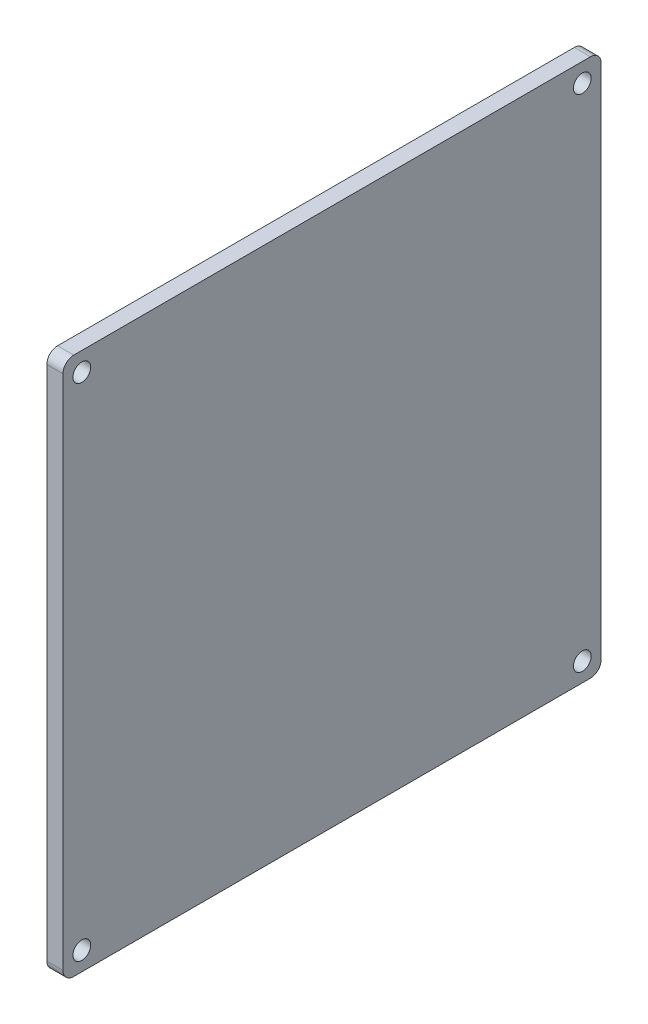
ISO-10303-21;
HEADER;
FILE_DESCRIPTION(('STEP AP214'),'2;1');
FILE_NAME('part.step','',(''),(''),'','','');
FILE_SCHEMA(('AUTOMOTIVE_DESIGN { 1 0 10303 214 1 1 1 1 }'));
ENDSEC;
DATA;
#1=APPLICATION_CONTEXT('core data for automotive mechanical design processes');
#2=APPLICATION_PROTOCOL_DEFINITION('international standard','automotive_design',2000,#1);
#3=PRODUCT_CONTEXT('',#1,'mechanical');
#4=PRODUCT('Part','Part','',(#3));
#5=PRODUCT_RELATED_PRODUCT_CATEGORY('part','',(#4));
#6=PRODUCT_DEFINITION_FORMATION('','',#4);
#7=PRODUCT_DEFINITION_CONTEXT('part definition',#1,'design');
#8=PRODUCT_DEFINITION('design','',#6,#7);
#9=PRODUCT_DEFINITION_SHAPE('','',#8);
#10=(LENGTH_UNIT() NAMED_UNIT(*) SI_UNIT(.MILLI.,.METRE.));
#11=(NAMED_UNIT(*) PLANE_ANGLE_UNIT() SI_UNIT($,.RADIAN.));
#12=(NAMED_UNIT(*) SI_UNIT($,.STERADIAN.) SOLID_ANGLE_UNIT());
#13=UNCERTAINTY_MEASURE_WITH_UNIT(LENGTH_MEASURE(1.E-05),#10,'distance_accuracy_value','');
#14=(GEOMETRIC_REPRESENTATION_CONTEXT(3) GLOBAL_UNCERTAINTY_ASSIGNED_CONTEXT((#13)) GLOBAL_UNIT_ASSIGNED_CONTEXT((#10,
#11,#12)) REPRESENTATION_CONTEXT('',''));
#15=CARTESIAN_POINT('',(0.,0.,0.));
#16=DIRECTION('',(0.,0.,1.));
#17=DIRECTION('',(1.,0.,0.));
#18=AXIS2_PLACEMENT_3D('',#15,#16,#17);
#19=CARTESIAN_POINT('',(3.,0.,0.));
#20=DIRECTION('',(0.,0.,-1.));
#21=DIRECTION('',(0.,1.,0.));
#22=AXIS2_PLACEMENT_3D('',#19,#20,#21);
#23=PLANE('',#22);
#24=DIRECTION('',(0.,-1.,0.));
#25=VECTOR('',#24,1.);
#26=CARTESIAN_POINT('',(3.,0.,0.));
#27=LINE('',#26,#25);
#28=CARTESIAN_POINT('',(3.,-2.,0.));
#29=VERTEX_POINT('',#28);
#30=CARTESIAN_POINT('',(3.,-98.,0.));
#31=VERTEX_POINT('',#30);
#32=EDGE_CURVE('E127',#29,#31,#27,.T.);
#33=ORIENTED_EDGE('',*,*,#32,.F.);
#34=DIRECTION('',(-1.,0.,0.));
#35=VECTOR('',#34,1.);
#36=CARTESIAN_POINT('',(3.,-2.,0.));
#37=LINE('',#36,#35);
#38=CARTESIAN_POINT('',(0.,-2.,0.));
#39=VERTEX_POINT('',#38);
#40=EDGE_CURVE('E141',#29,#39,#37,.T.);
#41=ORIENTED_EDGE('',*,*,#40,.T.);
#42=DIRECTION('',(0.,-1.,0.));
#43=VECTOR('',#42,1.);
#44=CARTESIAN_POINT('',(0.,0.,0.));
#45=LINE('',#44,#43);
#46=CARTESIAN_POINT('',(0.,-98.,0.));
#47=VERTEX_POINT('',#46);
#48=EDGE_CURVE('E162',#39,#47,#45,.T.);
#49=ORIENTED_EDGE('',*,*,#48,.T.);
#50=DIRECTION('',(-1.,0.,0.));
#51=VECTOR('',#50,1.);
#52=CARTESIAN_POINT('',(3.,-98.,0.));
#53=LINE('',#52,#51);
#54=EDGE_CURVE('E139',#47,#31,#53,.F.);
#55=ORIENTED_EDGE('',*,*,#54,.T.);
#56=EDGE_LOOP('',(#33,#41,#49,#55));
#57=FACE_BOUND('',#56,.T.);
#58=ADVANCED_FACE('F36',(#57),#23,.F.);
#59=CARTESIAN_POINT('',(3.,-100.,0.));
#60=DIRECTION('',(0.,1.,0.));
#61=DIRECTION('',(0.,0.,1.));
#62=AXIS2_PLACEMENT_3D('',#59,#60,#61);
#63=PLANE('',#62);
#64=DIRECTION('',(0.,0.,-1.));
#65=VECTOR('',#64,1.);
#66=CARTESIAN_POINT('',(3.,-100.,0.));
#67=LINE('',#66,#65);
#68=CARTESIAN_POINT('',(3.,-100.,-2.00000000000001));
#69=VERTEX_POINT('',#68);
#70=CARTESIAN_POINT('',(3.,-100.,-98.));
#71=VERTEX_POINT('',#70);
#72=EDGE_CURVE('E130',#69,#71,#67,.T.);
#73=ORIENTED_EDGE('',*,*,#72,.F.);
#74=DIRECTION('',(-1.,0.,0.));
#75=VECTOR('',#74,1.);
#76=CARTESIAN_POINT('',(3.,-100.,-2.00000000000001));
#77=LINE('',#76,#75);
#78=CARTESIAN_POINT('',(0.,-100.,-2.00000000000001));
#79=VERTEX_POINT('',#78);
#80=EDGE_CURVE('E44',#69,#79,#77,.T.);
#81=ORIENTED_EDGE('',*,*,#80,.T.);
#82=DIRECTION('',(0.,0.,-1.));
#83=VECTOR('',#82,1.);
#84=CARTESIAN_POINT('',(0.,-100.,0.));
#85=LINE('',#84,#83);
#86=CARTESIAN_POINT('',(0.,-100.,-98.));
#87=VERTEX_POINT('',#86);
#88=EDGE_CURVE('E132',#79,#87,#85,.T.);
#89=ORIENTED_EDGE('',*,*,#88,.T.);
#90=DIRECTION('',(-1.,0.,0.));
#91=VECTOR('',#90,1.);
#92=CARTESIAN_POINT('',(3.,-100.,-98.));
#93=LINE('',#92,#91);
#94=EDGE_CURVE('E51',#87,#71,#93,.F.);
#95=ORIENTED_EDGE('',*,*,#94,.T.);
#96=EDGE_LOOP('',(#73,#81,#89,#95));
#97=FACE_BOUND('',#96,.T.);
#98=ADVANCED_FACE('F159',(#97),#63,.F.);
#99=CARTESIAN_POINT('',(3.,0.,-100.));
#100=DIRECTION('',(0.,0.,1.));
#101=DIRECTION('',(0.,-1.,0.));
#102=AXIS2_PLACEMENT_3D('',#99,#100,#101);
#103=PLANE('',#102);
#104=DIRECTION('',(0.,1.,0.));
#105=VECTOR('',#104,1.);
#106=CARTESIAN_POINT('',(3.,0.,-100.));
#107=LINE('',#106,#105);
#108=CARTESIAN_POINT('',(3.,-98.,-100.));
#109=VERTEX_POINT('',#108);
#110=CARTESIAN_POINT('',(3.,-2.,-100.));
#111=VERTEX_POINT('',#110);
#112=EDGE_CURVE('E167',#109,#111,#107,.T.);
#113=ORIENTED_EDGE('',*,*,#112,.F.);
#114=DIRECTION('',(-1.,0.,0.));
#115=VECTOR('',#114,1.);
#116=CARTESIAN_POINT('',(3.,-98.,-100.));
#117=LINE('',#116,#115);
#118=CARTESIAN_POINT('',(0.,-98.,-100.));
#119=VERTEX_POINT('',#118);
#120=EDGE_CURVE('E11',#109,#119,#117,.T.);
#121=ORIENTED_EDGE('',*,*,#120,.T.);
#122=DIRECTION('',(0.,1.,0.));
#123=VECTOR('',#122,1.);
#124=CARTESIAN_POINT('',(0.,0.,-100.));
#125=LINE('',#124,#123);
#126=CARTESIAN_POINT('',(0.,-2.,-100.));
#127=VERTEX_POINT('',#126);
#128=EDGE_CURVE('E128',#119,#127,#125,.T.);
#129=ORIENTED_EDGE('',*,*,#128,.T.);
#130=DIRECTION('',(-1.,0.,0.));
#131=VECTOR('',#130,1.);
#132=CARTESIAN_POINT('',(3.,-2.,-100.));
#133=LINE('',#132,#131);
#134=EDGE_CURVE('E110',#127,#111,#133,.F.);
#135=ORIENTED_EDGE('',*,*,#134,.T.);
#136=EDGE_LOOP('',(#113,#121,#129,#135));
#137=FACE_BOUND('',#136,.T.);
#138=ADVANCED_FACE('F232',(#137),#103,.F.);
#139=CARTESIAN_POINT('',(3.,0.,0.));
#140=DIRECTION('',(0.,-1.,0.));
#141=DIRECTION('',(0.,0.,-1.));
#142=AXIS2_PLACEMENT_3D('',#139,#140,#141);
#143=PLANE('',#142);
#144=DIRECTION('',(0.,0.,1.));
#145=VECTOR('',#144,1.);
#146=CARTESIAN_POINT('',(0.,0.,0.));
#147=LINE('',#146,#145);
#148=CARTESIAN_POINT('',(0.,0.,-98.));
#149=VERTEX_POINT('',#148);
#150=CARTESIAN_POINT('',(0.,0.,-2.));
#151=VERTEX_POINT('',#150);
#152=EDGE_CURVE('E119',#149,#151,#147,.T.);
#153=ORIENTED_EDGE('',*,*,#152,.T.);
#154=DIRECTION('',(-1.,0.,0.));
#155=VECTOR('',#154,1.);
#156=CARTESIAN_POINT('',(3.,0.,-2.));
#157=LINE('',#156,#155);
#158=CARTESIAN_POINT('',(3.,0.,-2.));
#159=VERTEX_POINT('',#158);
#160=EDGE_CURVE('E149',#151,#159,#157,.F.);
#161=ORIENTED_EDGE('',*,*,#160,.T.);
#162=DIRECTION('',(0.,0.,1.));
#163=VECTOR('',#162,1.);
#164=CARTESIAN_POINT('',(3.,0.,0.));
#165=LINE('',#164,#163);
#166=CARTESIAN_POINT('',(3.,0.,-98.));
#167=VERTEX_POINT('',#166);
#168=EDGE_CURVE('E122',#167,#159,#165,.T.);
#169=ORIENTED_EDGE('',*,*,#168,.F.);
#170=DIRECTION('',(-1.,0.,0.));
#171=VECTOR('',#170,1.);
#172=CARTESIAN_POINT('',(3.,0.,-98.));
#173=LINE('',#172,#171);
#174=EDGE_CURVE('E108',#167,#149,#173,.T.);
#175=ORIENTED_EDGE('',*,*,#174,.T.);
#176=EDGE_LOOP('',(#153,#161,#169,#175));
#177=FACE_BOUND('',#176,.T.);
#178=ADVANCED_FACE('F118',(#177),#143,.F.);
#179=CARTESIAN_POINT('',(3.,0.,0.));
#180=DIRECTION('',(1.,0.,0.));
#181=DIRECTION('',(0.,0.,-1.));
#182=AXIS2_PLACEMENT_3D('',#179,#180,#181);
#183=PLANE('',#182);
#184=CARTESIAN_POINT('',(3.,-96.5,-3.49999999999897));
#185=DIRECTION('',(1.,0.,0.));
#186=DIRECTION('',(0.,0.,1.));
#187=AXIS2_PLACEMENT_3D('',#184,#185,#186);
#188=CIRCLE('',#187,1.65);
#189=CARTESIAN_POINT('',(3.,-96.5,-1.84999999999897));
#190=VERTEX_POINT('',#189);
#191=EDGE_CURVE('E188',#190,#190,#188,.T.);
#192=ORIENTED_EDGE('',*,*,#191,.F.);
#193=EDGE_LOOP('',(#192));
#194=FACE_BOUND('',#193,.T.);
#195=CARTESIAN_POINT('',(3.,-96.5,-96.499999999999));
#196=DIRECTION('',(1.,0.,0.));
#197=DIRECTION('',(0.,0.,-1.));
#198=AXIS2_PLACEMENT_3D('',#195,#196,#197);
#199=CIRCLE('',#198,1.65000000000002);
#200=CARTESIAN_POINT('',(3.,-96.5,-98.149999999999));
#201=VERTEX_POINT('',#200);
#202=EDGE_CURVE('E182',#201,#201,#199,.T.);
#203=ORIENTED_EDGE('',*,*,#202,.F.);
#204=EDGE_LOOP('',(#203));
#205=FACE_BOUND('',#204,.T.);
#206=CARTESIAN_POINT('',(3.,-3.5,-96.499999999999));
#207=DIRECTION('',(1.,0.,0.));
#208=DIRECTION('',(0.,0.,1.));
#209=AXIS2_PLACEMENT_3D('',#206,#207,#208);
#210=CIRCLE('',#209,1.65000000000002);
#211=CARTESIAN_POINT('',(3.,-3.5,-94.849999999999));
#212=VERTEX_POINT('',#211);
#213=EDGE_CURVE('E176',#212,#212,#210,.T.);
#214=ORIENTED_EDGE('',*,*,#213,.F.);
#215=EDGE_LOOP('',(#214));
#216=FACE_BOUND('',#215,.T.);
#217=CARTESIAN_POINT('',(3.,-3.5,-3.49999999999897));
#218=DIRECTION('',(1.,0.,0.));
#219=DIRECTION('',(0.,0.,-1.));
#220=AXIS2_PLACEMENT_3D('',#217,#218,#219);
#221=CIRCLE('',#220,1.65);
#222=CARTESIAN_POINT('',(3.,-3.5,-5.14999999999897));
#223=VERTEX_POINT('',#222);
#224=EDGE_CURVE('E170',#223,#223,#221,.T.);
#225=ORIENTED_EDGE('',*,*,#224,.F.);
#226=EDGE_LOOP('',(#225));
#227=FACE_BOUND('',#226,.T.);
#228=ORIENTED_EDGE('',*,*,#168,.T.);
#229=CARTESIAN_POINT('',(3.,-2.,-2.));
#230=DIRECTION('',(1.,0.,0.));
#231=DIRECTION('',(0.,0.,-1.));
#232=AXIS2_PLACEMENT_3D('',#229,#230,#231);
#233=CIRCLE('',#232,2.);
#234=EDGE_CURVE('E154',#159,#29,#233,.T.);
#235=ORIENTED_EDGE('',*,*,#234,.T.);
#236=ORIENTED_EDGE('',*,*,#32,.T.);
#237=CARTESIAN_POINT('',(3.,-98.,-2.00000000000001));
#238=DIRECTION('',(1.,0.,0.));
#239=DIRECTION('',(0.,0.,-1.));
#240=AXIS2_PLACEMENT_3D('',#237,#238,#239);
#241=CIRCLE('',#240,2.);
#242=EDGE_CURVE('E58',#31,#69,#241,.T.);
#243=ORIENTED_EDGE('',*,*,#242,.T.);
#244=ORIENTED_EDGE('',*,*,#72,.T.);
#245=CARTESIAN_POINT('',(3.,-98.,-98.));
#246=DIRECTION('',(1.,0.,0.));
#247=DIRECTION('',(0.,0.,-1.));
#248=AXIS2_PLACEMENT_3D('',#245,#246,#247);
#249=CIRCLE('',#248,2.);
#250=EDGE_CURVE('E151',#71,#109,#249,.T.);
#251=ORIENTED_EDGE('',*,*,#250,.T.);
#252=ORIENTED_EDGE('',*,*,#112,.T.);
#253=CARTESIAN_POINT('',(3.,-2.,-98.));
#254=DIRECTION('',(1.,0.,0.));
#255=DIRECTION('',(0.,0.,-1.));
#256=AXIS2_PLACEMENT_3D('',#253,#254,#255);
#257=CIRCLE('',#256,2.);
#258=EDGE_CURVE('E137',#111,#167,#257,.T.);
#259=ORIENTED_EDGE('',*,*,#258,.T.);
#260=EDGE_LOOP('',(#228,#235,#236,#243,#244,#251,#252,#259));
#261=FACE_BOUND('',#260,.T.);
#262=ADVANCED_FACE('F203',(#194,#205,#216,#227,#261),#183,.T.);
#263=CARTESIAN_POINT('',(0.,0.,0.));
#264=DIRECTION('',(1.,0.,0.));
#265=DIRECTION('',(0.,0.,-1.));
#266=AXIS2_PLACEMENT_3D('',#263,#264,#265);
#267=PLANE('',#266);
#268=CARTESIAN_POINT('',(0.,-96.5,-3.49999999999897));
#269=DIRECTION('',(1.,0.,0.));
#270=DIRECTION('',(0.,0.,1.));
#271=AXIS2_PLACEMENT_3D('',#268,#269,#270);
#272=CIRCLE('',#271,1.65);
#273=CARTESIAN_POINT('',(0.,-96.5,-1.84999999999897));
#274=VERTEX_POINT('',#273);
#275=EDGE_CURVE('E185',#274,#274,#272,.T.);
#276=ORIENTED_EDGE('',*,*,#275,.T.);
#277=EDGE_LOOP('',(#276));
#278=FACE_BOUND('',#277,.T.);
#279=CARTESIAN_POINT('',(0.,-96.5,-96.499999999999));
#280=DIRECTION('',(1.,0.,0.));
#281=DIRECTION('',(0.,0.,-1.));
#282=AXIS2_PLACEMENT_3D('',#279,#280,#281);
#283=CIRCLE('',#282,1.65000000000002);
#284=CARTESIAN_POINT('',(0.,-96.5,-98.149999999999));
#285=VERTEX_POINT('',#284);
#286=EDGE_CURVE('E179',#285,#285,#283,.T.);
#287=ORIENTED_EDGE('',*,*,#286,.T.);
#288=EDGE_LOOP('',(#287));
#289=FACE_BOUND('',#288,.T.);
#290=CARTESIAN_POINT('',(0.,-3.5,-96.499999999999));
#291=DIRECTION('',(1.,0.,0.));
#292=DIRECTION('',(0.,0.,1.));
#293=AXIS2_PLACEMENT_3D('',#290,#291,#292);
#294=CIRCLE('',#293,1.65000000000002);
#295=CARTESIAN_POINT('',(0.,-3.5,-94.849999999999));
#296=VERTEX_POINT('',#295);
#297=EDGE_CURVE('E173',#296,#296,#294,.T.);
#298=ORIENTED_EDGE('',*,*,#297,.T.);
#299=EDGE_LOOP('',(#298));
#300=FACE_BOUND('',#299,.T.);
#301=CARTESIAN_POINT('',(0.,-3.5,-3.49999999999897));
#302=DIRECTION('',(1.,0.,0.));
#303=DIRECTION('',(0.,0.,-1.));
#304=AXIS2_PLACEMENT_3D('',#301,#302,#303);
#305=CIRCLE('',#304,1.65);
#306=CARTESIAN_POINT('',(0.,-3.5,-5.14999999999897));
#307=VERTEX_POINT('',#306);
#308=EDGE_CURVE('E163',#307,#307,#305,.T.);
#309=ORIENTED_EDGE('',*,*,#308,.T.);
#310=EDGE_LOOP('',(#309));
#311=FACE_BOUND('',#310,.T.);
#312=ORIENTED_EDGE('',*,*,#48,.F.);
#313=CARTESIAN_POINT('',(0.,-2.,-2.));
#314=DIRECTION('',(1.,0.,0.));
#315=DIRECTION('',(0.,0.,-1.));
#316=AXIS2_PLACEMENT_3D('',#313,#314,#315);
#317=CIRCLE('',#316,2.);
#318=EDGE_CURVE('E126',#39,#151,#317,.F.);
#319=ORIENTED_EDGE('',*,*,#318,.T.);
#320=ORIENTED_EDGE('',*,*,#152,.F.);
#321=CARTESIAN_POINT('',(0.,-2.,-98.));
#322=DIRECTION('',(1.,0.,0.));
#323=DIRECTION('',(0.,0.,-1.));
#324=AXIS2_PLACEMENT_3D('',#321,#322,#323);
#325=CIRCLE('',#324,2.);
#326=EDGE_CURVE('E104',#149,#127,#325,.F.);
#327=ORIENTED_EDGE('',*,*,#326,.T.);
#328=ORIENTED_EDGE('',*,*,#128,.F.);
#329=CARTESIAN_POINT('',(0.,-98.,-98.));
#330=DIRECTION('',(1.,0.,0.));
#331=DIRECTION('',(0.,0.,-1.));
#332=AXIS2_PLACEMENT_3D('',#329,#330,#331);
#333=CIRCLE('',#332,2.);
#334=EDGE_CURVE('E144',#119,#87,#333,.F.);
#335=ORIENTED_EDGE('',*,*,#334,.T.);
#336=ORIENTED_EDGE('',*,*,#88,.F.);
#337=CARTESIAN_POINT('',(0.,-98.,-2.00000000000001));
#338=DIRECTION('',(1.,0.,0.));
#339=DIRECTION('',(0.,0.,-1.));
#340=AXIS2_PLACEMENT_3D('',#337,#338,#339);
#341=CIRCLE('',#340,2.);
#342=EDGE_CURVE('E146',#79,#47,#341,.F.);
#343=ORIENTED_EDGE('',*,*,#342,.T.);
#344=EDGE_LOOP('',(#312,#319,#320,#327,#328,#335,#336,#343));
#345=FACE_BOUND('',#344,.T.);
#346=ADVANCED_FACE('F125',(#278,#289,#300,#311,#345),#267,.F.);
#347=CARTESIAN_POINT('',(0.,-3.5,-3.49999999999897));
#348=DIRECTION('',(1.,0.,0.));
#349=DIRECTION('',(0.,0.,-1.));
#350=AXIS2_PLACEMENT_3D('',#347,#348,#349);
#351=CYLINDRICAL_SURFACE('',#350,1.65);
#352=ORIENTED_EDGE('',*,*,#308,.F.);
#353=EDGE_LOOP('',(#352));
#354=FACE_BOUND('',#353,.T.);
#355=ORIENTED_EDGE('',*,*,#224,.T.);
#356=EDGE_LOOP('',(#355));
#357=FACE_BOUND('',#356,.T.);
#358=ADVANCED_FACE('F265',(#354,#357),#351,.F.);
#359=CARTESIAN_POINT('',(0.,-3.5,-96.499999999999));
#360=DIRECTION('',(1.,0.,0.));
#361=DIRECTION('',(0.,0.,-1.));
#362=AXIS2_PLACEMENT_3D('',#359,#360,#361);
#363=CYLINDRICAL_SURFACE('',#362,1.65000000000002);
#364=ORIENTED_EDGE('',*,*,#297,.F.);
#365=EDGE_LOOP('',(#364));
#366=FACE_BOUND('',#365,.T.);
#367=ORIENTED_EDGE('',*,*,#213,.T.);
#368=EDGE_LOOP('',(#367));
#369=FACE_BOUND('',#368,.T.);
#370=ADVANCED_FACE('F307',(#366,#369),#363,.F.);
#371=CARTESIAN_POINT('',(0.,-96.5,-96.499999999999));
#372=DIRECTION('',(1.,0.,0.));
#373=DIRECTION('',(0.,0.,-1.));
#374=AXIS2_PLACEMENT_3D('',#371,#372,#373);
#375=CYLINDRICAL_SURFACE('',#374,1.65000000000002);
#376=ORIENTED_EDGE('',*,*,#286,.F.);
#377=EDGE_LOOP('',(#376));
#378=FACE_BOUND('',#377,.T.);
#379=ORIENTED_EDGE('',*,*,#202,.T.);
#380=EDGE_LOOP('',(#379));
#381=FACE_BOUND('',#380,.T.);
#382=ADVANCED_FACE('F199',(#378,#381),#375,.F.);
#383=CARTESIAN_POINT('',(0.,-96.5,-3.49999999999897));
#384=DIRECTION('',(1.,0.,0.));
#385=DIRECTION('',(0.,0.,-1.));
#386=AXIS2_PLACEMENT_3D('',#383,#384,#385);
#387=CYLINDRICAL_SURFACE('',#386,1.65);
#388=ORIENTED_EDGE('',*,*,#275,.F.);
#389=EDGE_LOOP('',(#388));
#390=FACE_BOUND('',#389,.T.);
#391=ORIENTED_EDGE('',*,*,#191,.T.);
#392=EDGE_LOOP('',(#391));
#393=FACE_BOUND('',#392,.T.);
#394=ADVANCED_FACE('F196',(#390,#393),#387,.F.);
#395=CARTESIAN_POINT('',(3.,-2.,-98.));
#396=DIRECTION('',(-1.,0.,0.));
#397=DIRECTION('',(0.,0.,1.));
#398=AXIS2_PLACEMENT_3D('',#395,#396,#397);
#399=CYLINDRICAL_SURFACE('',#398,2.);
#400=ORIENTED_EDGE('',*,*,#258,.F.);
#401=ORIENTED_EDGE('',*,*,#134,.F.);
#402=ORIENTED_EDGE('',*,*,#326,.F.);
#403=ORIENTED_EDGE('',*,*,#174,.F.);
#404=EDGE_LOOP('',(#400,#401,#402,#403));
#405=FACE_BOUND('',#404,.T.);
#406=ADVANCED_FACE('F107',(#405),#399,.T.);
#407=CARTESIAN_POINT('',(3.,-2.,-2.));
#408=DIRECTION('',(-1.,0.,0.));
#409=DIRECTION('',(0.,0.,1.));
#410=AXIS2_PLACEMENT_3D('',#407,#408,#409);
#411=CYLINDRICAL_SURFACE('',#410,2.);
#412=ORIENTED_EDGE('',*,*,#234,.F.);
#413=ORIENTED_EDGE('',*,*,#160,.F.);
#414=ORIENTED_EDGE('',*,*,#318,.F.);
#415=ORIENTED_EDGE('',*,*,#40,.F.);
#416=EDGE_LOOP('',(#412,#413,#414,#415));
#417=FACE_BOUND('',#416,.T.);
#418=ADVANCED_FACE('F216',(#417),#411,.T.);
#419=CARTESIAN_POINT('',(3.,-98.,-2.00000000000001));
#420=DIRECTION('',(-1.,0.,0.));
#421=DIRECTION('',(0.,0.,1.));
#422=AXIS2_PLACEMENT_3D('',#419,#420,#421);
#423=CYLINDRICAL_SURFACE('',#422,2.);
#424=ORIENTED_EDGE('',*,*,#242,.F.);
#425=ORIENTED_EDGE('',*,*,#54,.F.);
#426=ORIENTED_EDGE('',*,*,#342,.F.);
#427=ORIENTED_EDGE('',*,*,#80,.F.);
#428=EDGE_LOOP('',(#424,#425,#426,#427));
#429=FACE_BOUND('',#428,.T.);
#430=ADVANCED_FACE('F219',(#429),#423,.T.);
#431=CARTESIAN_POINT('',(3.,-98.,-98.));
#432=DIRECTION('',(-1.,0.,0.));
#433=DIRECTION('',(0.,0.,1.));
#434=AXIS2_PLACEMENT_3D('',#431,#432,#433);
#435=CYLINDRICAL_SURFACE('',#434,2.);
#436=ORIENTED_EDGE('',*,*,#250,.F.);
#437=ORIENTED_EDGE('',*,*,#94,.F.);
#438=ORIENTED_EDGE('',*,*,#334,.F.);
#439=ORIENTED_EDGE('',*,*,#120,.F.);
#440=EDGE_LOOP('',(#436,#437,#438,#439));
#441=FACE_BOUND('',#440,.T.);
#442=ADVANCED_FACE('F38',(#441),#435,.T.);
#443=CLOSED_SHELL('',(#58,#98,#138,#178,#262,#346,#358,#370,#382,#394,#406,#418,#430,#442));
#444=MANIFOLD_SOLID_BREP('B2',#443);
#445=ADVANCED_BREP_SHAPE_REPRESENTATION('',(#18,#444),#14);
#446=SHAPE_DEFINITION_REPRESENTATION(#9,#445);
ENDSEC;
END-ISO-10303-21;
